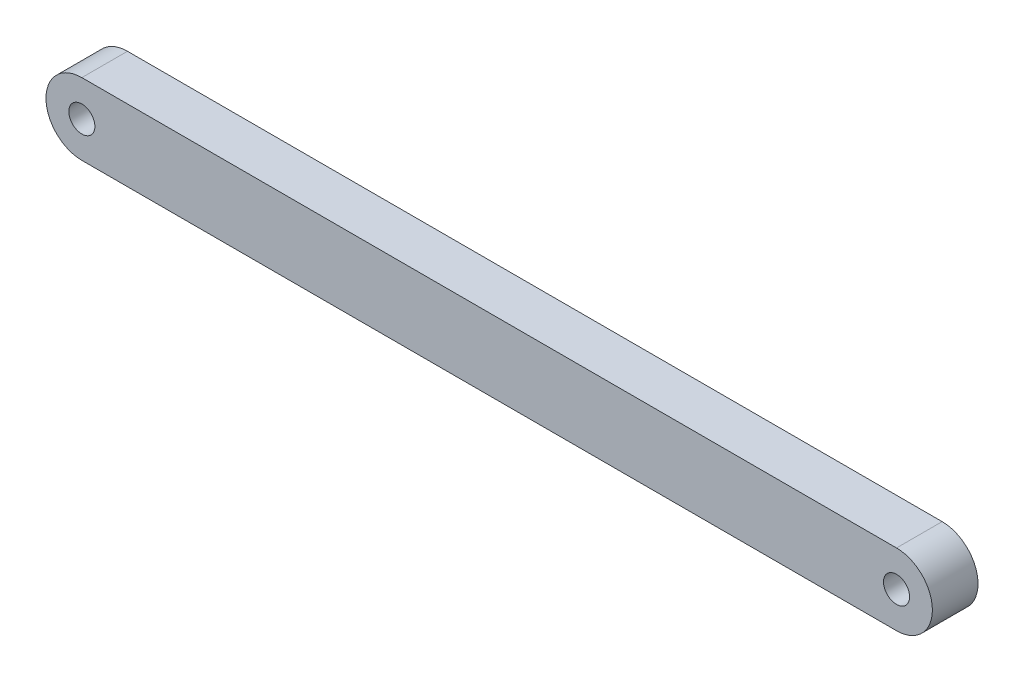
ISO-10303-21;
HEADER;
FILE_DESCRIPTION(('STEP AP214'),'2;1');
FILE_NAME('part.step','',(''),(''),'','','');
FILE_SCHEMA(('AUTOMOTIVE_DESIGN { 1 0 10303 214 1 1 1 1 }'));
ENDSEC;
DATA;
#1=APPLICATION_CONTEXT('core data for automotive mechanical design processes');
#2=APPLICATION_PROTOCOL_DEFINITION('international standard','automotive_design',2000,#1);
#3=PRODUCT_CONTEXT('',#1,'mechanical');
#4=PRODUCT('Part','Part','',(#3));
#5=PRODUCT_RELATED_PRODUCT_CATEGORY('part','',(#4));
#6=PRODUCT_DEFINITION_FORMATION('','',#4);
#7=PRODUCT_DEFINITION_CONTEXT('part definition',#1,'design');
#8=PRODUCT_DEFINITION('design','',#6,#7);
#9=PRODUCT_DEFINITION_SHAPE('','',#8);
#10=(LENGTH_UNIT() NAMED_UNIT(*) SI_UNIT(.MILLI.,.METRE.));
#11=(NAMED_UNIT(*) PLANE_ANGLE_UNIT() SI_UNIT($,.RADIAN.));
#12=(NAMED_UNIT(*) SI_UNIT($,.STERADIAN.) SOLID_ANGLE_UNIT());
#13=UNCERTAINTY_MEASURE_WITH_UNIT(LENGTH_MEASURE(1.E-05),#10,'distance_accuracy_value','');
#14=(GEOMETRIC_REPRESENTATION_CONTEXT(3) GLOBAL_UNCERTAINTY_ASSIGNED_CONTEXT((#13)) GLOBAL_UNIT_ASSIGNED_CONTEXT((#10,
#11,#12)) REPRESENTATION_CONTEXT('',''));
#15=CARTESIAN_POINT('',(0.,0.,0.));
#16=DIRECTION('',(0.,0.,1.));
#17=DIRECTION('',(1.,0.,0.));
#18=AXIS2_PLACEMENT_3D('',#15,#16,#17);
#19=CARTESIAN_POINT('',(0.,0.,14.));
#20=DIRECTION('',(0.,0.,-1.));
#21=DIRECTION('',(-1.,0.,0.));
#22=AXIS2_PLACEMENT_3D('',#19,#20,#21);
#23=CYLINDRICAL_SURFACE('',#22,11.);
#24=CARTESIAN_POINT('',(0.,0.,0.));
#25=DIRECTION('',(0.,0.,1.));
#26=DIRECTION('',(1.,0.,0.));
#27=AXIS2_PLACEMENT_3D('',#24,#25,#26);
#28=CIRCLE('',#27,11.);
#29=CARTESIAN_POINT('',(0.,11.,0.));
#30=VERTEX_POINT('',#29);
#31=CARTESIAN_POINT('',(0.,-11.,0.));
#32=VERTEX_POINT('',#31);
#33=EDGE_CURVE('E113',#30,#32,#28,.T.);
#34=ORIENTED_EDGE('',*,*,#33,.T.);
#35=DIRECTION('',(0.,0.,-1.));
#36=VECTOR('',#35,1.);
#37=CARTESIAN_POINT('',(0.,-11.,14.));
#38=LINE('',#37,#36);
#39=CARTESIAN_POINT('',(0.,-11.,14.));
#40=VERTEX_POINT('',#39);
#41=EDGE_CURVE('E11',#40,#32,#38,.T.);
#42=ORIENTED_EDGE('',*,*,#41,.F.);
#43=CARTESIAN_POINT('',(0.,0.,14.));
#44=DIRECTION('',(0.,0.,1.));
#45=DIRECTION('',(1.,0.,0.));
#46=AXIS2_PLACEMENT_3D('',#43,#44,#45);
#47=CIRCLE('',#46,11.);
#48=CARTESIAN_POINT('',(0.,11.,14.));
#49=VERTEX_POINT('',#48);
#50=EDGE_CURVE('E97',#49,#40,#47,.T.);
#51=ORIENTED_EDGE('',*,*,#50,.F.);
#52=DIRECTION('',(0.,0.,-1.));
#53=VECTOR('',#52,1.);
#54=CARTESIAN_POINT('',(0.,11.,14.));
#55=LINE('',#54,#53);
#56=EDGE_CURVE('E109',#49,#30,#55,.T.);
#57=ORIENTED_EDGE('',*,*,#56,.T.);
#58=EDGE_LOOP('',(#34,#42,#51,#57));
#59=FACE_BOUND('',#58,.T.);
#60=ADVANCED_FACE('F45',(#59),#23,.T.);
#61=CARTESIAN_POINT('',(0.,-11.,14.));
#62=DIRECTION('',(0.,1.,0.));
#63=DIRECTION('',(-1.,0.,0.));
#64=AXIS2_PLACEMENT_3D('',#61,#62,#63);
#65=PLANE('',#64);
#66=DIRECTION('',(1.,0.,0.));
#67=VECTOR('',#66,1.);
#68=CARTESIAN_POINT('',(0.,-11.,0.));
#69=LINE('',#68,#67);
#70=CARTESIAN_POINT('',(250.,-11.,0.));
#71=VERTEX_POINT('',#70);
#72=EDGE_CURVE('E102',#32,#71,#69,.T.);
#73=ORIENTED_EDGE('',*,*,#72,.T.);
#74=DIRECTION('',(0.,0.,-1.));
#75=VECTOR('',#74,1.);
#76=CARTESIAN_POINT('',(250.,-11.,14.));
#77=LINE('',#76,#75);
#78=CARTESIAN_POINT('',(250.,-11.,14.));
#79=VERTEX_POINT('',#78);
#80=EDGE_CURVE('E54',#79,#71,#77,.T.);
#81=ORIENTED_EDGE('',*,*,#80,.F.);
#82=DIRECTION('',(1.,0.,0.));
#83=VECTOR('',#82,1.);
#84=CARTESIAN_POINT('',(0.,-11.,14.));
#85=LINE('',#84,#83);
#86=EDGE_CURVE('E92',#40,#79,#85,.T.);
#87=ORIENTED_EDGE('',*,*,#86,.F.);
#88=ORIENTED_EDGE('',*,*,#41,.T.);
#89=EDGE_LOOP('',(#73,#81,#87,#88));
#90=FACE_BOUND('',#89,.T.);
#91=ADVANCED_FACE('F101',(#90),#65,.F.);
#92=CARTESIAN_POINT('',(250.,0.,14.));
#93=DIRECTION('',(0.,0.,-1.));
#94=DIRECTION('',(-1.,0.,0.));
#95=AXIS2_PLACEMENT_3D('',#92,#93,#94);
#96=CYLINDRICAL_SURFACE('',#95,11.);
#97=CARTESIAN_POINT('',(250.,0.,0.));
#98=DIRECTION('',(0.,0.,1.));
#99=DIRECTION('',(1.,0.,0.));
#100=AXIS2_PLACEMENT_3D('',#97,#98,#99);
#101=CIRCLE('',#100,11.);
#102=CARTESIAN_POINT('',(250.,11.,0.));
#103=VERTEX_POINT('',#102);
#104=EDGE_CURVE('E79',#71,#103,#101,.T.);
#105=ORIENTED_EDGE('',*,*,#104,.T.);
#106=DIRECTION('',(0.,0.,-1.));
#107=VECTOR('',#106,1.);
#108=CARTESIAN_POINT('',(250.,11.,14.));
#109=LINE('',#108,#107);
#110=CARTESIAN_POINT('',(250.,11.,14.));
#111=VERTEX_POINT('',#110);
#112=EDGE_CURVE('E104',#111,#103,#109,.T.);
#113=ORIENTED_EDGE('',*,*,#112,.F.);
#114=CARTESIAN_POINT('',(250.,0.,14.));
#115=DIRECTION('',(0.,0.,1.));
#116=DIRECTION('',(1.,0.,0.));
#117=AXIS2_PLACEMENT_3D('',#114,#115,#116);
#118=CIRCLE('',#117,11.);
#119=EDGE_CURVE('E95',#79,#111,#118,.T.);
#120=ORIENTED_EDGE('',*,*,#119,.F.);
#121=ORIENTED_EDGE('',*,*,#80,.T.);
#122=EDGE_LOOP('',(#105,#113,#120,#121));
#123=FACE_BOUND('',#122,.T.);
#124=ADVANCED_FACE('F105',(#123),#96,.T.);
#125=CARTESIAN_POINT('',(0.,11.,14.));
#126=DIRECTION('',(0.,-1.,0.));
#127=DIRECTION('',(1.,0.,0.));
#128=AXIS2_PLACEMENT_3D('',#125,#126,#127);
#129=PLANE('',#128);
#130=DIRECTION('',(-1.,0.,0.));
#131=VECTOR('',#130,1.);
#132=CARTESIAN_POINT('',(0.,11.,0.));
#133=LINE('',#132,#131);
#134=EDGE_CURVE('E85',#103,#30,#133,.T.);
#135=ORIENTED_EDGE('',*,*,#134,.T.);
#136=ORIENTED_EDGE('',*,*,#56,.F.);
#137=DIRECTION('',(-1.,0.,0.));
#138=VECTOR('',#137,1.);
#139=CARTESIAN_POINT('',(0.,11.,14.));
#140=LINE('',#139,#138);
#141=EDGE_CURVE('E62',#111,#49,#140,.T.);
#142=ORIENTED_EDGE('',*,*,#141,.F.);
#143=ORIENTED_EDGE('',*,*,#112,.T.);
#144=EDGE_LOOP('',(#135,#136,#142,#143));
#145=FACE_BOUND('',#144,.T.);
#146=ADVANCED_FACE('F127',(#145),#129,.F.);
#147=CARTESIAN_POINT('',(0.,0.,14.));
#148=DIRECTION('',(0.,0.,1.));
#149=DIRECTION('',(1.,0.,0.));
#150=AXIS2_PLACEMENT_3D('',#147,#148,#149);
#151=PLANE('',#150);
#152=CARTESIAN_POINT('',(0.,0.,14.));
#153=DIRECTION('',(0.,0.,1.));
#154=DIRECTION('',(1.,0.,0.));
#155=AXIS2_PLACEMENT_3D('',#152,#153,#154);
#156=CIRCLE('',#155,4.);
#157=CARTESIAN_POINT('',(4.,0.,14.));
#158=VERTEX_POINT('',#157);
#159=EDGE_CURVE('E117',#158,#158,#156,.T.);
#160=ORIENTED_EDGE('',*,*,#159,.F.);
#161=EDGE_LOOP('',(#160));
#162=FACE_BOUND('',#161,.T.);
#163=CARTESIAN_POINT('',(250.,0.,14.));
#164=DIRECTION('',(0.,0.,1.));
#165=DIRECTION('',(1.,0.,0.));
#166=AXIS2_PLACEMENT_3D('',#163,#164,#165);
#167=CIRCLE('',#166,3.99999999999999);
#168=CARTESIAN_POINT('',(254.,0.,14.));
#169=VERTEX_POINT('',#168);
#170=EDGE_CURVE('E134',#169,#169,#167,.T.);
#171=ORIENTED_EDGE('',*,*,#170,.F.);
#172=EDGE_LOOP('',(#171));
#173=FACE_BOUND('',#172,.T.);
#174=ORIENTED_EDGE('',*,*,#50,.T.);
#175=ORIENTED_EDGE('',*,*,#86,.T.);
#176=ORIENTED_EDGE('',*,*,#119,.T.);
#177=ORIENTED_EDGE('',*,*,#141,.T.);
#178=EDGE_LOOP('',(#174,#175,#176,#177));
#179=FACE_BOUND('',#178,.T.);
#180=ADVANCED_FACE('F93',(#162,#173,#179),#151,.T.);
#181=CARTESIAN_POINT('',(0.,0.,0.));
#182=DIRECTION('',(0.,0.,1.));
#183=DIRECTION('',(1.,0.,0.));
#184=AXIS2_PLACEMENT_3D('',#181,#182,#183);
#185=PLANE('',#184);
#186=CARTESIAN_POINT('',(0.,0.,0.));
#187=DIRECTION('',(0.,0.,1.));
#188=DIRECTION('',(1.,0.,0.));
#189=AXIS2_PLACEMENT_3D('',#186,#187,#188);
#190=CIRCLE('',#189,4.);
#191=CARTESIAN_POINT('',(4.,0.,0.));
#192=VERTEX_POINT('',#191);
#193=EDGE_CURVE('E142',#192,#192,#190,.T.);
#194=ORIENTED_EDGE('',*,*,#193,.T.);
#195=EDGE_LOOP('',(#194));
#196=FACE_BOUND('',#195,.T.);
#197=CARTESIAN_POINT('',(250.,0.,0.));
#198=DIRECTION('',(0.,0.,1.));
#199=DIRECTION('',(1.,0.,0.));
#200=AXIS2_PLACEMENT_3D('',#197,#198,#199);
#201=CIRCLE('',#200,3.99999999999999);
#202=CARTESIAN_POINT('',(254.,0.,0.));
#203=VERTEX_POINT('',#202);
#204=EDGE_CURVE('E138',#203,#203,#201,.T.);
#205=ORIENTED_EDGE('',*,*,#204,.T.);
#206=EDGE_LOOP('',(#205));
#207=FACE_BOUND('',#206,.T.);
#208=ORIENTED_EDGE('',*,*,#33,.F.);
#209=ORIENTED_EDGE('',*,*,#134,.F.);
#210=ORIENTED_EDGE('',*,*,#104,.F.);
#211=ORIENTED_EDGE('',*,*,#72,.F.);
#212=EDGE_LOOP('',(#208,#209,#210,#211));
#213=FACE_BOUND('',#212,.T.);
#214=ADVANCED_FACE('F130',(#196,#207,#213),#185,.F.);
#215=CARTESIAN_POINT('',(250.,0.,14.));
#216=DIRECTION('',(0.,0.,-1.));
#217=DIRECTION('',(-1.,0.,0.));
#218=AXIS2_PLACEMENT_3D('',#215,#216,#217);
#219=CYLINDRICAL_SURFACE('',#218,3.99999999999999);
#220=ORIENTED_EDGE('',*,*,#170,.T.);
#221=EDGE_LOOP('',(#220));
#222=FACE_BOUND('',#221,.T.);
#223=ORIENTED_EDGE('',*,*,#204,.F.);
#224=EDGE_LOOP('',(#223));
#225=FACE_BOUND('',#224,.T.);
#226=ADVANCED_FACE('F158',(#222,#225),#219,.F.);
#227=CARTESIAN_POINT('',(0.,0.,14.));
#228=DIRECTION('',(0.,0.,-1.));
#229=DIRECTION('',(-1.,0.,0.));
#230=AXIS2_PLACEMENT_3D('',#227,#228,#229);
#231=CYLINDRICAL_SURFACE('',#230,4.);
#232=ORIENTED_EDGE('',*,*,#159,.T.);
#233=EDGE_LOOP('',(#232));
#234=FACE_BOUND('',#233,.T.);
#235=ORIENTED_EDGE('',*,*,#193,.F.);
#236=EDGE_LOOP('',(#235));
#237=FACE_BOUND('',#236,.T.);
#238=ADVANCED_FACE('F150',(#234,#237),#231,.F.);
#239=CLOSED_SHELL('',(#60,#91,#124,#146,#180,#214,#226,#238));
#240=MANIFOLD_SOLID_BREP('B2',#239);
#241=ADVANCED_BREP_SHAPE_REPRESENTATION('',(#18,#240),#14);
#242=SHAPE_DEFINITION_REPRESENTATION(#9,#241);
ENDSEC;
END-ISO-10303-21;
